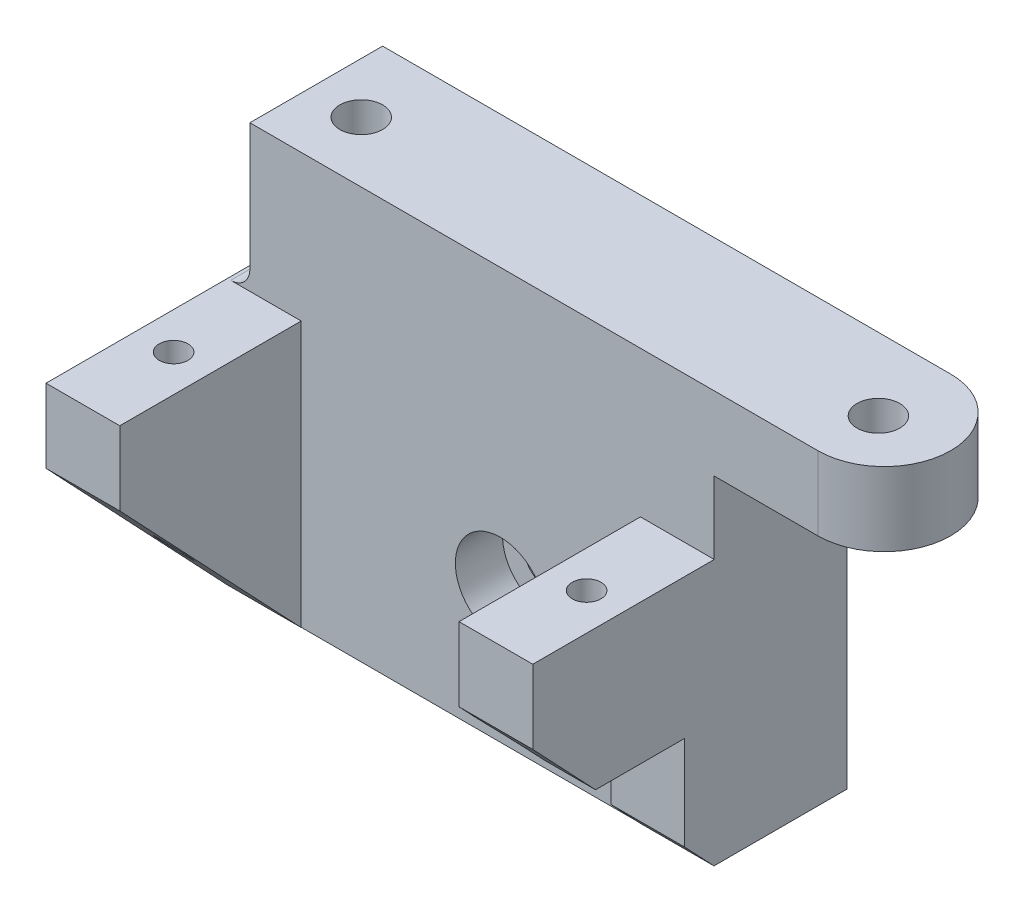
ISO-10303-21;
HEADER;
FILE_DESCRIPTION(('STEP AP214'),'2;1');
FILE_NAME('part.step','',(''),(''),'','','');
FILE_SCHEMA(('AUTOMOTIVE_DESIGN { 1 0 10303 214 1 1 1 1 }'));
ENDSEC;
DATA;
#1=APPLICATION_CONTEXT('core data for automotive mechanical design processes');
#2=APPLICATION_PROTOCOL_DEFINITION('international standard','automotive_design',2000,#1);
#3=PRODUCT_CONTEXT('',#1,'mechanical');
#4=PRODUCT('Part','Part','',(#3));
#5=PRODUCT_RELATED_PRODUCT_CATEGORY('part','',(#4));
#6=PRODUCT_DEFINITION_FORMATION('','',#4);
#7=PRODUCT_DEFINITION_CONTEXT('part definition',#1,'design');
#8=PRODUCT_DEFINITION('design','',#6,#7);
#9=PRODUCT_DEFINITION_SHAPE('','',#8);
#10=(LENGTH_UNIT() NAMED_UNIT(*) SI_UNIT(.MILLI.,.METRE.));
#11=(NAMED_UNIT(*) PLANE_ANGLE_UNIT() SI_UNIT($,.RADIAN.));
#12=(NAMED_UNIT(*) SI_UNIT($,.STERADIAN.) SOLID_ANGLE_UNIT());
#13=UNCERTAINTY_MEASURE_WITH_UNIT(LENGTH_MEASURE(1.E-05),#10,'distance_accuracy_value','');
#14=(GEOMETRIC_REPRESENTATION_CONTEXT(3) GLOBAL_UNCERTAINTY_ASSIGNED_CONTEXT((#13)) GLOBAL_UNIT_ASSIGNED_CONTEXT((#10,
#11,#12)) REPRESENTATION_CONTEXT('',''));
#15=CARTESIAN_POINT('',(0.,0.,0.));
#16=DIRECTION('',(0.,0.,1.));
#17=DIRECTION('',(1.,0.,0.));
#18=AXIS2_PLACEMENT_3D('',#15,#16,#17);
#19=CARTESIAN_POINT('',(16.5,0.,9.));
#20=DIRECTION('',(-1.,0.,0.));
#21=DIRECTION('',(0.,0.,1.));
#22=AXIS2_PLACEMENT_3D('',#19,#20,#21);
#23=PLANE('',#22);
#24=DIRECTION('',(0.,0.,-1.));
#25=VECTOR('',#24,1.);
#26=CARTESIAN_POINT('',(16.5,13.8916881917778,9.));
#27=LINE('',#26,#25);
#28=CARTESIAN_POINT('',(16.5,13.8916881917778,9.));
#29=VERTEX_POINT('',#28);
#30=CARTESIAN_POINT('',(16.5,13.8916881917778,0.));
#31=VERTEX_POINT('',#30);
#32=EDGE_CURVE('E483',#29,#31,#27,.T.);
#33=ORIENTED_EDGE('',*,*,#32,.F.);
#34=DIRECTION('',(0.,-1.,0.));
#35=VECTOR('',#34,1.);
#36=CARTESIAN_POINT('',(16.5,18.8916881917778,9.));
#37=LINE('',#36,#35);
#38=CARTESIAN_POINT('',(16.5,8.99168819177776,9.));
#39=VERTEX_POINT('',#38);
#40=EDGE_CURVE('E401',#29,#39,#37,.T.);
#41=ORIENTED_EDGE('',*,*,#40,.T.);
#42=DIRECTION('',(0.,0.,-1.));
#43=VECTOR('',#42,1.);
#44=CARTESIAN_POINT('',(16.5,8.99168819177776,9.));
#45=LINE('',#44,#43);
#46=CARTESIAN_POINT('',(16.5,8.99168819177776,21.3));
#47=VERTEX_POINT('',#46);
#48=EDGE_CURVE('E209',#47,#39,#45,.T.);
#49=ORIENTED_EDGE('',*,*,#48,.F.);
#50=DIRECTION('',(0.,1.,0.));
#51=VECTOR('',#50,1.);
#52=CARTESIAN_POINT('',(16.5,3.99168819177776,21.3));
#53=LINE('',#52,#51);
#54=CARTESIAN_POINT('',(16.5,3.99168819177776,21.3));
#55=VERTEX_POINT('',#54);
#56=EDGE_CURVE('E371',#55,#47,#53,.T.);
#57=ORIENTED_EDGE('',*,*,#56,.F.);
#58=DIRECTION('',(0.,-0.726393020388627,-0.687279550060009));
#59=VECTOR('',#58,1.);
#60=CARTESIAN_POINT('',(16.5,-4.25510472842094,13.4972651601197));
#61=LINE('',#60,#59);
#62=CARTESIAN_POINT('',(16.5,-0.508311808222242,17.0423076923077));
#63=VERTEX_POINT('',#62);
#64=EDGE_CURVE('E238',#55,#63,#61,.T.);
#65=ORIENTED_EDGE('',*,*,#64,.T.);
#66=DIRECTION('',(0.,0.,-1.));
#67=VECTOR('',#66,1.);
#68=CARTESIAN_POINT('',(16.5,-0.508311808222242,19.));
#69=LINE('',#68,#67);
#70=CARTESIAN_POINT('',(16.5,-0.508311808222242,11.));
#71=VERTEX_POINT('',#70);
#72=EDGE_CURVE('E453',#63,#71,#69,.T.);
#73=ORIENTED_EDGE('',*,*,#72,.T.);
#74=DIRECTION('',(0.,1.,0.));
#75=VECTOR('',#74,1.);
#76=CARTESIAN_POINT('',(16.5,0.,11.));
#77=LINE('',#76,#75);
#78=CARTESIAN_POINT('',(16.5,-6.89449067001086,11.));
#79=VERTEX_POINT('',#78);
#80=EDGE_CURVE('E454',#79,#71,#77,.T.);
#81=ORIENTED_EDGE('',*,*,#80,.F.);
#82=CARTESIAN_POINT('',(16.5,-8.99168819177775,9.01572849863594));
#83=VERTEX_POINT('',#82);
#84=EDGE_CURVE('E237',#79,#83,#61,.T.);
#85=ORIENTED_EDGE('',*,*,#84,.T.);
#86=DIRECTION('',(0.,0.,-1.));
#87=VECTOR('',#86,1.);
#88=CARTESIAN_POINT('',(16.5,-8.99168819177775,9.));
#89=LINE('',#88,#87);
#90=CARTESIAN_POINT('',(16.5,-8.99168819177775,0.));
#91=VERTEX_POINT('',#90);
#92=EDGE_CURVE('E228',#83,#91,#89,.T.);
#93=ORIENTED_EDGE('',*,*,#92,.T.);
#94=DIRECTION('',(0.,1.,0.));
#95=VECTOR('',#94,1.);
#96=CARTESIAN_POINT('',(16.5,0.,0.));
#97=LINE('',#96,#95);
#98=EDGE_CURVE('E218',#91,#31,#97,.T.);
#99=ORIENTED_EDGE('',*,*,#98,.T.);
#100=EDGE_LOOP('',(#33,#41,#49,#57,#65,#73,#81,#85,#93,#99));
#101=FACE_BOUND('',#100,.T.);
#102=ADVANCED_FACE('F47',(#101),#23,.F.);
#103=CARTESIAN_POINT('',(11.5,3.99168819177776,9.));
#104=DIRECTION('',(-1.,0.,0.));
#105=DIRECTION('',(0.,0.,1.));
#106=AXIS2_PLACEMENT_3D('',#103,#104,#105);
#107=PLANE('',#106);
#108=DIRECTION('',(0.,0.726393020388627,0.687279550060009));
#109=VECTOR('',#108,1.);
#110=CARTESIAN_POINT('',(11.5,-9.00831180822224,9.));
#111=LINE('',#110,#109);
#112=CARTESIAN_POINT('',(11.5,-8.99168819177775,9.01572849863594));
#113=VERTEX_POINT('',#112);
#114=CARTESIAN_POINT('',(11.5,-6.89449067001086,11.));
#115=VERTEX_POINT('',#114);
#116=EDGE_CURVE('E234',#113,#115,#111,.T.);
#117=ORIENTED_EDGE('',*,*,#116,.T.);
#118=DIRECTION('',(0.,1.,0.));
#119=VECTOR('',#118,1.);
#120=CARTESIAN_POINT('',(11.5,0.,11.));
#121=LINE('',#120,#119);
#122=CARTESIAN_POINT('',(11.5,-2.6556543449779,11.));
#123=VERTEX_POINT('',#122);
#124=EDGE_CURVE('E507',#115,#123,#121,.T.);
#125=ORIENTED_EDGE('',*,*,#124,.T.);
#126=DIRECTION('',(0.,0.,-1.));
#127=VECTOR('',#126,1.);
#128=CARTESIAN_POINT('',(11.5,-2.6556543449779,21.3));
#129=LINE('',#128,#127);
#130=CARTESIAN_POINT('',(11.5,-2.6556543449779,9.));
#131=VERTEX_POINT('',#130);
#132=EDGE_CURVE('E266',#123,#131,#129,.T.);
#133=ORIENTED_EDGE('',*,*,#132,.T.);
#134=DIRECTION('',(0.,1.,0.));
#135=VECTOR('',#134,1.);
#136=CARTESIAN_POINT('',(11.5,3.99168819177776,9.));
#137=LINE('',#136,#135);
#138=CARTESIAN_POINT('',(11.5,-8.99168819177775,9.));
#139=VERTEX_POINT('',#138);
#140=EDGE_CURVE('E369',#139,#131,#137,.T.);
#141=ORIENTED_EDGE('',*,*,#140,.F.);
#142=DIRECTION('',(0.,0.,-1.));
#143=VECTOR('',#142,1.);
#144=CARTESIAN_POINT('',(11.5,-8.99168819177775,9.));
#145=LINE('',#144,#143);
#146=EDGE_CURVE('E249',#139,#113,#145,.F.);
#147=ORIENTED_EDGE('',*,*,#146,.T.);
#148=EDGE_LOOP('',(#117,#125,#133,#141,#147));
#149=FACE_BOUND('',#148,.T.);
#150=ADVANCED_FACE('F311',(#149),#107,.T.);
#151=CARTESIAN_POINT('',(0.,-9.00831180822224,9.));
#152=DIRECTION('',(0.,0.687279550060009,-0.726393020388627));
#153=DIRECTION('',(-1.,0.,0.));
#154=AXIS2_PLACEMENT_3D('',#151,#152,#153);
#155=PLANE('',#154);
#156=DIRECTION('',(1.,0.,0.));
#157=VECTOR('',#156,1.);
#158=CARTESIAN_POINT('',(0.,-6.89449067001086,11.));
#159=LINE('',#158,#157);
#160=EDGE_CURVE('E380',#115,#79,#159,.T.);
#161=ORIENTED_EDGE('',*,*,#160,.F.);
#162=ORIENTED_EDGE('',*,*,#116,.F.);
#163=DIRECTION('',(-1.,0.,0.));
#164=VECTOR('',#163,1.);
#165=CARTESIAN_POINT('',(0.,-8.99168819177775,9.01572849863594));
#166=LINE('',#165,#164);
#167=EDGE_CURVE('E231',#83,#113,#166,.T.);
#168=ORIENTED_EDGE('',*,*,#167,.F.);
#169=ORIENTED_EDGE('',*,*,#84,.F.);
#170=EDGE_LOOP('',(#161,#162,#168,#169));
#171=FACE_BOUND('',#170,.T.);
#172=ADVANCED_FACE('F317',(#171),#155,.F.);
#173=CARTESIAN_POINT('',(0.,8.99168819177776,9.));
#174=DIRECTION('',(0.,1.,0.));
#175=DIRECTION('',(-1.,0.,0.));
#176=AXIS2_PLACEMENT_3D('',#173,#174,#175);
#177=PLANE('',#176);
#178=DIRECTION('',(1.,0.,0.));
#179=VECTOR('',#178,1.);
#180=CARTESIAN_POINT('',(-16.5,8.99168819177775,9.));
#181=LINE('',#180,#179);
#182=CARTESIAN_POINT('',(-16.28,8.99168819177775,9.));
#183=VERTEX_POINT('',#182);
#184=CARTESIAN_POINT('',(-11.5,8.99168819177775,9.));
#185=VERTEX_POINT('',#184);
#186=EDGE_CURVE('E378',#183,#185,#181,.T.);
#187=ORIENTED_EDGE('',*,*,#186,.F.);
#188=DIRECTION('',(0.,0.,-1.));
#189=VECTOR('',#188,1.);
#190=CARTESIAN_POINT('',(-16.28,8.99168819177775,9.));
#191=LINE('',#190,#189);
#192=CARTESIAN_POINT('',(-16.28,8.99168819177775,0.));
#193=VERTEX_POINT('',#192);
#194=EDGE_CURVE('E197',#183,#193,#191,.T.);
#195=ORIENTED_EDGE('',*,*,#194,.T.);
#196=DIRECTION('',(-1.,0.,0.));
#197=VECTOR('',#196,1.);
#198=CARTESIAN_POINT('',(-16.5,8.99168819177775,0.));
#199=LINE('',#198,#197);
#200=CARTESIAN_POINT('',(-16.5,8.99168819177775,0.));
#201=VERTEX_POINT('',#200);
#202=EDGE_CURVE('E189',#193,#201,#199,.T.);
#203=ORIENTED_EDGE('',*,*,#202,.T.);
#204=DIRECTION('',(0.,0.,-1.));
#205=VECTOR('',#204,1.);
#206=CARTESIAN_POINT('',(-16.5,8.99168819177775,9.));
#207=LINE('',#206,#205);
#208=CARTESIAN_POINT('',(-16.5,8.99168819177775,21.3));
#209=VERTEX_POINT('',#208);
#210=EDGE_CURVE('E194',#209,#201,#207,.T.);
#211=ORIENTED_EDGE('',*,*,#210,.F.);
#212=DIRECTION('',(1.,0.,0.));
#213=VECTOR('',#212,1.);
#214=CARTESIAN_POINT('',(-16.5,8.99168819177775,21.3));
#215=LINE('',#214,#213);
#216=CARTESIAN_POINT('',(-11.5,8.99168819177775,21.3));
#217=VERTEX_POINT('',#216);
#218=EDGE_CURVE('E365',#209,#217,#215,.T.);
#219=ORIENTED_EDGE('',*,*,#218,.T.);
#220=DIRECTION('',(0.,0.,-1.));
#221=VECTOR('',#220,1.);
#222=CARTESIAN_POINT('',(-11.5,8.99168819177775,9.));
#223=LINE('',#222,#221);
#224=EDGE_CURVE('E358',#217,#185,#223,.T.);
#225=ORIENTED_EDGE('',*,*,#224,.T.);
#226=EDGE_LOOP('',(#187,#195,#203,#211,#219,#225));
#227=FACE_BOUND('',#226,.T.);
#228=CARTESIAN_POINT('',(-14.,8.99168819177775,15.15));
#229=DIRECTION('',(0.,1.,0.));
#230=DIRECTION('',(-1.,0.,0.));
#231=AXIS2_PLACEMENT_3D('',#228,#229,#230);
#232=CIRCLE('',#231,0.975);
#233=CARTESIAN_POINT('',(-14.975,8.99168819177775,15.15));
#234=VERTEX_POINT('',#233);
#235=EDGE_CURVE('E277',#234,#234,#232,.T.);
#236=ORIENTED_EDGE('',*,*,#235,.F.);
#237=EDGE_LOOP('',(#236));
#238=FACE_BOUND('',#237,.T.);
#239=ADVANCED_FACE('F191',(#227,#238),#177,.T.);
#240=CARTESIAN_POINT('',(11.5,2.6556543449779,9.));
#241=VERTEX_POINT('',#240);
#242=CARTESIAN_POINT('',(11.5,8.99168819177776,9.));
#243=VERTEX_POINT('',#242);
#244=EDGE_CURVE('E427',#241,#243,#137,.T.);
#245=ORIENTED_EDGE('',*,*,#244,.F.);
#246=DIRECTION('',(0.,0.,-1.));
#247=VECTOR('',#246,1.);
#248=CARTESIAN_POINT('',(11.5,2.6556543449779,21.3));
#249=LINE('',#248,#247);
#250=CARTESIAN_POINT('',(11.5,2.6556543449779,20.0359064372586));
#251=VERTEX_POINT('',#250);
#252=EDGE_CURVE('E413',#241,#251,#249,.F.);
#253=ORIENTED_EDGE('',*,*,#252,.T.);
#254=CARTESIAN_POINT('',(11.5,3.99168819177776,21.3));
#255=VERTEX_POINT('',#254);
#256=EDGE_CURVE('E233',#251,#255,#111,.T.);
#257=ORIENTED_EDGE('',*,*,#256,.T.);
#258=DIRECTION('',(0.,1.,0.));
#259=VECTOR('',#258,1.);
#260=CARTESIAN_POINT('',(11.5,3.99168819177776,21.3));
#261=LINE('',#260,#259);
#262=CARTESIAN_POINT('',(11.5,8.99168819177776,21.3));
#263=VERTEX_POINT('',#262);
#264=EDGE_CURVE('E434',#255,#263,#261,.T.);
#265=ORIENTED_EDGE('',*,*,#264,.T.);
#266=DIRECTION('',(0.,0.,1.));
#267=VECTOR('',#266,1.);
#268=CARTESIAN_POINT('',(11.5,8.99168819177776,9.));
#269=LINE('',#268,#267);
#270=EDGE_CURVE('E423',#243,#263,#269,.T.);
#271=ORIENTED_EDGE('',*,*,#270,.F.);
#272=EDGE_LOOP('',(#245,#253,#257,#265,#271));
#273=FACE_BOUND('',#272,.T.);
#274=ADVANCED_FACE('F320',(#273),#107,.T.);
#275=CARTESIAN_POINT('',(10.,0.,21.3));
#276=DIRECTION('',(0.,0.,-1.));
#277=DIRECTION('',(-1.,0.,0.));
#278=AXIS2_PLACEMENT_3D('',#275,#276,#277);
#279=CYLINDRICAL_SURFACE('',#278,1.575);
#280=CARTESIAN_POINT('',(10.,0.,0.));
#281=DIRECTION('',(0.,0.,-1.));
#282=DIRECTION('',(-1.,0.,0.));
#283=AXIS2_PLACEMENT_3D('',#280,#281,#282);
#284=CIRCLE('',#283,1.575);
#285=CARTESIAN_POINT('',(8.425,0.,0.));
#286=VERTEX_POINT('',#285);
#287=EDGE_CURVE('E262',#286,#286,#284,.T.);
#288=ORIENTED_EDGE('',*,*,#287,.T.);
#289=EDGE_LOOP('',(#288));
#290=FACE_BOUND('',#289,.T.);
#291=CARTESIAN_POINT('',(10.,0.,5.8));
#292=DIRECTION('',(0.,0.,1.));
#293=DIRECTION('',(1.,0.,0.));
#294=AXIS2_PLACEMENT_3D('',#291,#292,#293);
#295=CIRCLE('',#294,1.575);
#296=CARTESIAN_POINT('',(11.575,0.,5.8));
#297=VERTEX_POINT('',#296);
#298=EDGE_CURVE('E263',#297,#297,#295,.F.);
#299=ORIENTED_EDGE('',*,*,#298,.F.);
#300=EDGE_LOOP('',(#299));
#301=FACE_BOUND('',#300,.T.);
#302=ADVANCED_FACE('F569',(#290,#301),#279,.F.);
#303=CARTESIAN_POINT('',(2.,0.,21.3));
#304=DIRECTION('',(0.,0.,-1.));
#305=DIRECTION('',(-1.,0.,0.));
#306=AXIS2_PLACEMENT_3D('',#303,#304,#305);
#307=CYLINDRICAL_SURFACE('',#306,1.575);
#308=CARTESIAN_POINT('',(2.,0.,0.));
#309=DIRECTION('',(0.,0.,-1.));
#310=DIRECTION('',(-1.,0.,0.));
#311=AXIS2_PLACEMENT_3D('',#308,#309,#310);
#312=CIRCLE('',#311,1.575);
#313=CARTESIAN_POINT('',(0.425,0.,0.));
#314=VERTEX_POINT('',#313);
#315=EDGE_CURVE('E420',#314,#314,#312,.T.);
#316=ORIENTED_EDGE('',*,*,#315,.T.);
#317=EDGE_LOOP('',(#316));
#318=FACE_BOUND('',#317,.T.);
#319=CARTESIAN_POINT('',(2.,0.,5.8));
#320=DIRECTION('',(0.,0.,1.));
#321=DIRECTION('',(1.,0.,0.));
#322=AXIS2_PLACEMENT_3D('',#319,#320,#321);
#323=CIRCLE('',#322,1.575);
#324=CARTESIAN_POINT('',(3.575,0.,5.8));
#325=VERTEX_POINT('',#324);
#326=EDGE_CURVE('E255',#325,#325,#323,.F.);
#327=ORIENTED_EDGE('',*,*,#326,.F.);
#328=EDGE_LOOP('',(#327));
#329=FACE_BOUND('',#328,.T.);
#330=ADVANCED_FACE('F328',(#318,#329),#307,.F.);
#331=CARTESIAN_POINT('',(0.,-8.99168819177775,9.));
#332=DIRECTION('',(0.,1.,0.));
#333=DIRECTION('',(0.,0.,1.));
#334=AXIS2_PLACEMENT_3D('',#331,#332,#333);
#335=PLANE('',#334);
#336=DIRECTION('',(1.,0.,0.));
#337=VECTOR('',#336,1.);
#338=CARTESIAN_POINT('',(0.,-8.99168819177775,0.));
#339=LINE('',#338,#337);
#340=CARTESIAN_POINT('',(-16.5,-8.99168819177775,0.));
#341=VERTEX_POINT('',#340);
#342=EDGE_CURVE('E216',#341,#91,#339,.T.);
#343=ORIENTED_EDGE('',*,*,#342,.T.);
#344=ORIENTED_EDGE('',*,*,#92,.F.);
#345=ORIENTED_EDGE('',*,*,#167,.T.);
#346=ORIENTED_EDGE('',*,*,#146,.F.);
#347=DIRECTION('',(1.,0.,0.));
#348=VECTOR('',#347,1.);
#349=CARTESIAN_POINT('',(0.,-8.99168819177775,9.));
#350=LINE('',#349,#348);
#351=CARTESIAN_POINT('',(-11.5,-8.99168819177775,9.));
#352=VERTEX_POINT('',#351);
#353=EDGE_CURVE('E217',#352,#139,#350,.T.);
#354=ORIENTED_EDGE('',*,*,#353,.F.);
#355=DIRECTION('',(0.,0.,1.));
#356=VECTOR('',#355,1.);
#357=CARTESIAN_POINT('',(-11.5,-8.99168819177775,9.));
#358=LINE('',#357,#356);
#359=CARTESIAN_POINT('',(-11.5,-8.99168819177775,9.01572849863594));
#360=VERTEX_POINT('',#359);
#361=EDGE_CURVE('E248',#352,#360,#358,.T.);
#362=ORIENTED_EDGE('',*,*,#361,.T.);
#363=DIRECTION('',(-1.,0.,0.));
#364=VECTOR('',#363,1.);
#365=CARTESIAN_POINT('',(0.,-8.99168819177775,9.01572849863594));
#366=LINE('',#365,#364);
#367=CARTESIAN_POINT('',(-16.5,-8.99168819177775,9.01572849863594));
#368=VERTEX_POINT('',#367);
#369=EDGE_CURVE('E241',#360,#368,#366,.T.);
#370=ORIENTED_EDGE('',*,*,#369,.T.);
#371=DIRECTION('',(0.,0.,-1.));
#372=VECTOR('',#371,1.);
#373=CARTESIAN_POINT('',(-16.5,-8.99168819177775,9.));
#374=LINE('',#373,#372);
#375=EDGE_CURVE('E210',#368,#341,#374,.T.);
#376=ORIENTED_EDGE('',*,*,#375,.T.);
#377=EDGE_LOOP('',(#343,#344,#345,#346,#354,#362,#370,#376));
#378=FACE_BOUND('',#377,.T.);
#379=ADVANCED_FACE('F325',(#378),#335,.F.);
#380=EDGE_CURVE('E269',#243,#39,#181,.T.);
#381=ORIENTED_EDGE('',*,*,#380,.F.);
#382=ORIENTED_EDGE('',*,*,#270,.T.);
#383=DIRECTION('',(1.,0.,0.));
#384=VECTOR('',#383,1.);
#385=CARTESIAN_POINT('',(16.5,8.99168819177776,21.3));
#386=LINE('',#385,#384);
#387=EDGE_CURVE('E428',#263,#47,#386,.T.);
#388=ORIENTED_EDGE('',*,*,#387,.T.);
#389=ORIENTED_EDGE('',*,*,#48,.T.);
#390=EDGE_LOOP('',(#381,#382,#388,#389));
#391=FACE_BOUND('',#390,.T.);
#392=CARTESIAN_POINT('',(14.,8.99168819177776,15.15));
#393=DIRECTION('',(0.,1.,0.));
#394=DIRECTION('',(1.,0.,0.));
#395=AXIS2_PLACEMENT_3D('',#392,#393,#394);
#396=CIRCLE('',#395,0.975);
#397=CARTESIAN_POINT('',(14.975,8.99168819177776,15.15));
#398=VERTEX_POINT('',#397);
#399=EDGE_CURVE('E278',#398,#398,#396,.T.);
#400=ORIENTED_EDGE('',*,*,#399,.F.);
#401=EDGE_LOOP('',(#400));
#402=FACE_BOUND('',#401,.T.);
#403=ADVANCED_FACE('F323',(#391,#402),#177,.T.);
#404=CARTESIAN_POINT('',(-16.5,0.,9.));
#405=DIRECTION('',(-1.,0.,0.));
#406=DIRECTION('',(0.,0.,1.));
#407=AXIS2_PLACEMENT_3D('',#404,#405,#406);
#408=PLANE('',#407);
#409=ORIENTED_EDGE('',*,*,#210,.T.);
#410=DIRECTION('',(0.,1.,0.));
#411=VECTOR('',#410,1.);
#412=CARTESIAN_POINT('',(-16.5,0.,0.));
#413=LINE('',#412,#411);
#414=EDGE_CURVE('E205',#341,#201,#413,.T.);
#415=ORIENTED_EDGE('',*,*,#414,.F.);
#416=ORIENTED_EDGE('',*,*,#375,.F.);
#417=DIRECTION('',(0.,0.726393020388627,0.687279550060009));
#418=VECTOR('',#417,1.);
#419=CARTESIAN_POINT('',(-16.5,-9.00831180822224,9.));
#420=LINE('',#419,#418);
#421=CARTESIAN_POINT('',(-16.5,3.99168819177775,21.3));
#422=VERTEX_POINT('',#421);
#423=EDGE_CURVE('E244',#368,#422,#420,.T.);
#424=ORIENTED_EDGE('',*,*,#423,.T.);
#425=DIRECTION('',(0.,1.,0.));
#426=VECTOR('',#425,1.);
#427=CARTESIAN_POINT('',(-16.5,3.99168819177775,21.3));
#428=LINE('',#427,#426);
#429=EDGE_CURVE('E207',#422,#209,#428,.T.);
#430=ORIENTED_EDGE('',*,*,#429,.T.);
#431=EDGE_LOOP('',(#409,#415,#416,#424,#430));
#432=FACE_BOUND('',#431,.T.);
#433=ADVANCED_FACE('F204',(#432),#408,.T.);
#434=CARTESIAN_POINT('',(0.,0.,9.));
#435=DIRECTION('',(0.,0.,1.));
#436=DIRECTION('',(1.,0.,0.));
#437=AXIS2_PLACEMENT_3D('',#434,#435,#436);
#438=PLANE('',#437);
#439=DIRECTION('',(0.,-1.,0.));
#440=VECTOR('',#439,1.);
#441=CARTESIAN_POINT('',(-14.98,18.8916881917778,9.));
#442=LINE('',#441,#440);
#443=CARTESIAN_POINT('',(-14.98,18.8916881917778,9.));
#444=VERTEX_POINT('',#443);
#445=CARTESIAN_POINT('',(-14.98,10.2916881917778,9.));
#446=VERTEX_POINT('',#445);
#447=EDGE_CURVE('E386',#444,#446,#442,.T.);
#448=ORIENTED_EDGE('',*,*,#447,.T.);
#449=CARTESIAN_POINT('',(-16.28,10.2916881917778,9.));
#450=DIRECTION('',(0.,0.,1.));
#451=DIRECTION('',(1.,0.,0.));
#452=AXIS2_PLACEMENT_3D('',#449,#450,#451);
#453=CIRCLE('',#452,1.3);
#454=EDGE_CURVE('E13',#446,#183,#453,.F.);
#455=ORIENTED_EDGE('',*,*,#454,.T.);
#456=ORIENTED_EDGE('',*,*,#186,.T.);
#457=DIRECTION('',(0.,1.,0.));
#458=VECTOR('',#457,1.);
#459=CARTESIAN_POINT('',(-11.5,3.99168819177775,9.));
#460=LINE('',#459,#458);
#461=EDGE_CURVE('E360',#352,#185,#460,.T.);
#462=ORIENTED_EDGE('',*,*,#461,.F.);
#463=ORIENTED_EDGE('',*,*,#353,.T.);
#464=ORIENTED_EDGE('',*,*,#140,.T.);
#465=CARTESIAN_POINT('',(10.,0.,9.));
#466=DIRECTION('',(0.,0.,1.));
#467=DIRECTION('',(1.,0.,0.));
#468=AXIS2_PLACEMENT_3D('',#465,#466,#467);
#469=CIRCLE('',#468,3.05);
#470=EDGE_CURVE('E410',#131,#241,#469,.F.);
#471=ORIENTED_EDGE('',*,*,#470,.T.);
#472=ORIENTED_EDGE('',*,*,#244,.T.);
#473=ORIENTED_EDGE('',*,*,#380,.T.);
#474=ORIENTED_EDGE('',*,*,#40,.F.);
#475=DIRECTION('',(-1.,0.,0.));
#476=VECTOR('',#475,1.);
#477=CARTESIAN_POINT('',(23.53,13.8916881917778,9.));
#478=LINE('',#477,#476);
#479=CARTESIAN_POINT('',(23.53,13.8916881917778,9.));
#480=VERTEX_POINT('',#479);
#481=EDGE_CURVE('E479',#480,#29,#478,.T.);
#482=ORIENTED_EDGE('',*,*,#481,.F.);
#483=DIRECTION('',(0.,1.,0.));
#484=VECTOR('',#483,1.);
#485=CARTESIAN_POINT('',(23.53,13.8916881917778,9.));
#486=LINE('',#485,#484);
#487=CARTESIAN_POINT('',(23.53,18.8916881917778,9.));
#488=VERTEX_POINT('',#487);
#489=EDGE_CURVE('E477',#480,#488,#486,.T.);
#490=ORIENTED_EDGE('',*,*,#489,.T.);
#491=DIRECTION('',(1.,0.,0.));
#492=VECTOR('',#491,1.);
#493=CARTESIAN_POINT('',(-16.5,18.8916881917778,9.));
#494=LINE('',#493,#492);
#495=EDGE_CURVE('E399',#444,#488,#494,.T.);
#496=ORIENTED_EDGE('',*,*,#495,.F.);
#497=EDGE_LOOP('',(#448,#455,#456,#462,#463,#464,#471,#472,#473,#474,#482,#490,#496));
#498=FACE_BOUND('',#497,.T.);
#499=CARTESIAN_POINT('',(2.,0.,9.));
#500=DIRECTION('',(0.,0.,1.));
#501=DIRECTION('',(1.,0.,0.));
#502=AXIS2_PLACEMENT_3D('',#499,#500,#501);
#503=CIRCLE('',#502,3.05);
#504=CARTESIAN_POINT('',(5.05,0.,9.));
#505=VERTEX_POINT('',#504);
#506=EDGE_CURVE('E258',#505,#505,#503,.F.);
#507=ORIENTED_EDGE('',*,*,#506,.T.);
#508=EDGE_LOOP('',(#507));
#509=FACE_BOUND('',#508,.T.);
#510=ADVANCED_FACE('F383',(#498,#509),#438,.T.);
#511=CARTESIAN_POINT('',(0.,0.,0.));
#512=DIRECTION('',(0.,0.,1.));
#513=DIRECTION('',(1.,0.,0.));
#514=AXIS2_PLACEMENT_3D('',#511,#512,#513);
#515=PLANE('',#514);
#516=ORIENTED_EDGE('',*,*,#202,.F.);
#517=CARTESIAN_POINT('',(-16.28,10.2916881917778,0.));
#518=DIRECTION('',(0.,0.,1.));
#519=DIRECTION('',(1.,0.,0.));
#520=AXIS2_PLACEMENT_3D('',#517,#518,#519);
#521=CIRCLE('',#520,1.3);
#522=CARTESIAN_POINT('',(-14.98,10.2916881917778,0.));
#523=VERTEX_POINT('',#522);
#524=EDGE_CURVE('E55',#193,#523,#521,.T.);
#525=ORIENTED_EDGE('',*,*,#524,.T.);
#526=DIRECTION('',(0.,-1.,0.));
#527=VECTOR('',#526,1.);
#528=CARTESIAN_POINT('',(-14.98,18.8916881917778,0.));
#529=LINE('',#528,#527);
#530=CARTESIAN_POINT('',(-14.98,18.8916881917778,0.));
#531=VERTEX_POINT('',#530);
#532=EDGE_CURVE('E200',#531,#523,#529,.T.);
#533=ORIENTED_EDGE('',*,*,#532,.F.);
#534=DIRECTION('',(-1.,0.,0.));
#535=VECTOR('',#534,1.);
#536=CARTESIAN_POINT('',(-16.5,18.8916881917778,0.));
#537=LINE('',#536,#535);
#538=CARTESIAN_POINT('',(23.53,18.8916881917778,0.));
#539=VERTEX_POINT('',#538);
#540=EDGE_CURVE('E379',#539,#531,#537,.T.);
#541=ORIENTED_EDGE('',*,*,#540,.F.);
#542=DIRECTION('',(0.,1.,0.));
#543=VECTOR('',#542,1.);
#544=CARTESIAN_POINT('',(23.53,13.8916881917778,0.));
#545=LINE('',#544,#543);
#546=CARTESIAN_POINT('',(23.53,13.8916881917778,0.));
#547=VERTEX_POINT('',#546);
#548=EDGE_CURVE('E484',#547,#539,#545,.T.);
#549=ORIENTED_EDGE('',*,*,#548,.F.);
#550=DIRECTION('',(1.,0.,0.));
#551=VECTOR('',#550,1.);
#552=CARTESIAN_POINT('',(23.53,13.8916881917778,0.));
#553=LINE('',#552,#551);
#554=EDGE_CURVE('E492',#31,#547,#553,.T.);
#555=ORIENTED_EDGE('',*,*,#554,.F.);
#556=ORIENTED_EDGE('',*,*,#98,.F.);
#557=ORIENTED_EDGE('',*,*,#342,.F.);
#558=ORIENTED_EDGE('',*,*,#414,.T.);
#559=EDGE_LOOP('',(#516,#525,#533,#541,#549,#555,#556,#557,#558));
#560=FACE_BOUND('',#559,.T.);
#561=ORIENTED_EDGE('',*,*,#287,.F.);
#562=EDGE_LOOP('',(#561));
#563=FACE_BOUND('',#562,.T.);
#564=ORIENTED_EDGE('',*,*,#315,.F.);
#565=EDGE_LOOP('',(#564));
#566=FACE_BOUND('',#565,.T.);
#567=ADVANCED_FACE('F213',(#560,#563,#566),#515,.F.);
#568=CARTESIAN_POINT('',(-11.5,3.99168819177775,9.));
#569=DIRECTION('',(1.,0.,0.));
#570=DIRECTION('',(0.,1.,0.));
#571=AXIS2_PLACEMENT_3D('',#568,#569,#570);
#572=PLANE('',#571);
#573=ORIENTED_EDGE('',*,*,#224,.F.);
#574=DIRECTION('',(0.,1.,0.));
#575=VECTOR('',#574,1.);
#576=CARTESIAN_POINT('',(-11.5,3.99168819177775,21.3));
#577=LINE('',#576,#575);
#578=CARTESIAN_POINT('',(-11.5,3.99168819177775,21.3));
#579=VERTEX_POINT('',#578);
#580=EDGE_CURVE('E354',#579,#217,#577,.T.);
#581=ORIENTED_EDGE('',*,*,#580,.F.);
#582=DIRECTION('',(0.,-0.726393020388627,-0.687279550060009));
#583=VECTOR('',#582,1.);
#584=CARTESIAN_POINT('',(-11.5,-9.00831180822224,9.));
#585=LINE('',#584,#583);
#586=EDGE_CURVE('E246',#579,#360,#585,.T.);
#587=ORIENTED_EDGE('',*,*,#586,.T.);
#588=ORIENTED_EDGE('',*,*,#361,.F.);
#589=ORIENTED_EDGE('',*,*,#461,.T.);
#590=EDGE_LOOP('',(#573,#581,#587,#588,#589));
#591=FACE_BOUND('',#590,.T.);
#592=ADVANCED_FACE('F355',(#591),#572,.T.);
#593=CARTESIAN_POINT('',(-16.5,3.99168819177775,21.3));
#594=DIRECTION('',(0.,0.,1.));
#595=DIRECTION('',(1.,0.,0.));
#596=AXIS2_PLACEMENT_3D('',#593,#594,#595);
#597=PLANE('',#596);
#598=ORIENTED_EDGE('',*,*,#218,.F.);
#599=ORIENTED_EDGE('',*,*,#429,.F.);
#600=DIRECTION('',(1.,0.,0.));
#601=VECTOR('',#600,1.);
#602=CARTESIAN_POINT('',(-16.5,3.99168819177775,21.3));
#603=LINE('',#602,#601);
#604=EDGE_CURVE('E350',#422,#579,#603,.T.);
#605=ORIENTED_EDGE('',*,*,#604,.T.);
#606=ORIENTED_EDGE('',*,*,#580,.T.);
#607=EDGE_LOOP('',(#598,#599,#605,#606));
#608=FACE_BOUND('',#607,.T.);
#609=ADVANCED_FACE('F362',(#608),#597,.T.);
#610=CARTESIAN_POINT('',(16.5,3.99168819177776,21.3));
#611=DIRECTION('',(0.,0.,1.));
#612=DIRECTION('',(1.,0.,0.));
#613=AXIS2_PLACEMENT_3D('',#610,#611,#612);
#614=PLANE('',#613);
#615=ORIENTED_EDGE('',*,*,#387,.F.);
#616=ORIENTED_EDGE('',*,*,#264,.F.);
#617=DIRECTION('',(1.,0.,0.));
#618=VECTOR('',#617,1.);
#619=CARTESIAN_POINT('',(16.5,3.99168819177776,21.3));
#620=LINE('',#619,#618);
#621=EDGE_CURVE('E424',#255,#55,#620,.T.);
#622=ORIENTED_EDGE('',*,*,#621,.T.);
#623=ORIENTED_EDGE('',*,*,#56,.T.);
#624=EDGE_LOOP('',(#615,#616,#622,#623));
#625=FACE_BOUND('',#624,.T.);
#626=ADVANCED_FACE('F333',(#625),#614,.T.);
#627=CARTESIAN_POINT('',(10.,0.,17.5232488647026));
#628=DIRECTION('',(0.,0.687279550060009,-0.726393020388627));
#629=DIRECTION('',(0.,-0.726393020388627,-0.687279550060009));
#630=AXIS2_PLACEMENT_3D('',#627,#628,#629);
#631=ELLIPSE('',#630,4.19882889068541,3.05);
#632=CARTESIAN_POINT('',(13.0073441947376,-0.508311808222242,17.0423076923077));
#633=VERTEX_POINT('',#632);
#634=EDGE_CURVE('E252',#633,#251,#631,.F.);
#635=ORIENTED_EDGE('',*,*,#634,.F.);
#636=DIRECTION('',(1.,0.,0.));
#637=VECTOR('',#636,1.);
#638=CARTESIAN_POINT('',(0.,-0.508311808222242,17.0423076923077));
#639=LINE('',#638,#637);
#640=EDGE_CURVE('E450',#633,#63,#639,.T.);
#641=ORIENTED_EDGE('',*,*,#640,.T.);
#642=ORIENTED_EDGE('',*,*,#64,.F.);
#643=ORIENTED_EDGE('',*,*,#621,.F.);
#644=ORIENTED_EDGE('',*,*,#256,.F.);
#645=EDGE_LOOP('',(#635,#641,#642,#643,#644));
#646=FACE_BOUND('',#645,.T.);
#647=ADVANCED_FACE('F330',(#646),#155,.F.);
#648=CARTESIAN_POINT('',(0.,-9.00831180822224,9.));
#649=DIRECTION('',(0.,0.687279550060009,-0.726393020388627));
#650=DIRECTION('',(-1.,0.,0.));
#651=AXIS2_PLACEMENT_3D('',#648,#649,#650);
#652=PLANE('',#651);
#653=CARTESIAN_POINT('',(-14.,-2.50831180822224,15.15));
#654=DIRECTION('',(0.,0.687279550060009,-0.726393020388627));
#655=DIRECTION('',(0.,0.726393020388627,0.687279550060009));
#656=AXIS2_PLACEMENT_3D('',#653,#654,#655);
#657=ELLIPSE('',#656,1.41863671036752,0.975);
#658=CARTESIAN_POINT('',(-14.,-1.4778240033442,16.125));
#659=VERTEX_POINT('',#658);
#660=EDGE_CURVE('E344',#659,#659,#657,.F.);
#661=ORIENTED_EDGE('',*,*,#660,.F.);
#662=EDGE_LOOP('',(#661));
#663=FACE_BOUND('',#662,.T.);
#664=ORIENTED_EDGE('',*,*,#586,.F.);
#665=ORIENTED_EDGE('',*,*,#604,.F.);
#666=ORIENTED_EDGE('',*,*,#423,.F.);
#667=ORIENTED_EDGE('',*,*,#369,.F.);
#668=EDGE_LOOP('',(#664,#665,#666,#667));
#669=FACE_BOUND('',#668,.T.);
#670=ADVANCED_FACE('F332',(#663,#669),#652,.F.);
#671=CARTESIAN_POINT('',(2.,0.,5.8));
#672=DIRECTION('',(0.,0.,1.));
#673=DIRECTION('',(1.,0.,0.));
#674=AXIS2_PLACEMENT_3D('',#671,#672,#673);
#675=PLANE('',#674);
#676=CARTESIAN_POINT('',(2.,0.,5.8));
#677=DIRECTION('',(0.,0.,1.));
#678=DIRECTION('',(1.,0.,0.));
#679=AXIS2_PLACEMENT_3D('',#676,#677,#678);
#680=CIRCLE('',#679,3.05);
#681=CARTESIAN_POINT('',(5.05,0.,5.8));
#682=VERTEX_POINT('',#681);
#683=EDGE_CURVE('E259',#682,#682,#680,.T.);
#684=ORIENTED_EDGE('',*,*,#683,.T.);
#685=EDGE_LOOP('',(#684));
#686=FACE_BOUND('',#685,.T.);
#687=ORIENTED_EDGE('',*,*,#326,.T.);
#688=EDGE_LOOP('',(#687));
#689=FACE_BOUND('',#688,.T.);
#690=ADVANCED_FACE('F305',(#686,#689),#675,.T.);
#691=CARTESIAN_POINT('',(2.,0.,21.3));
#692=DIRECTION('',(0.,0.,-1.));
#693=DIRECTION('',(-1.,0.,0.));
#694=AXIS2_PLACEMENT_3D('',#691,#692,#693);
#695=CYLINDRICAL_SURFACE('',#694,3.05);
#696=ORIENTED_EDGE('',*,*,#506,.F.);
#697=EDGE_LOOP('',(#696));
#698=FACE_BOUND('',#697,.T.);
#699=ORIENTED_EDGE('',*,*,#683,.F.);
#700=EDGE_LOOP('',(#699));
#701=FACE_BOUND('',#700,.T.);
#702=ADVANCED_FACE('F298',(#698,#701),#695,.F.);
#703=CARTESIAN_POINT('',(10.,0.,5.8));
#704=DIRECTION('',(0.,0.,1.));
#705=DIRECTION('',(1.,0.,0.));
#706=AXIS2_PLACEMENT_3D('',#703,#704,#705);
#707=PLANE('',#706);
#708=CARTESIAN_POINT('',(10.,0.,5.8));
#709=DIRECTION('',(0.,0.,1.));
#710=DIRECTION('',(1.,0.,0.));
#711=AXIS2_PLACEMENT_3D('',#708,#709,#710);
#712=CIRCLE('',#711,3.05);
#713=CARTESIAN_POINT('',(13.05,0.,5.8));
#714=VERTEX_POINT('',#713);
#715=EDGE_CURVE('E267',#714,#714,#712,.T.);
#716=ORIENTED_EDGE('',*,*,#715,.T.);
#717=EDGE_LOOP('',(#716));
#718=FACE_BOUND('',#717,.T.);
#719=ORIENTED_EDGE('',*,*,#298,.T.);
#720=EDGE_LOOP('',(#719));
#721=FACE_BOUND('',#720,.T.);
#722=ADVANCED_FACE('F296',(#718,#721),#707,.T.);
#723=CARTESIAN_POINT('',(10.,0.,21.3));
#724=DIRECTION('',(0.,0.,-1.));
#725=DIRECTION('',(-1.,0.,0.));
#726=AXIS2_PLACEMENT_3D('',#723,#724,#725);
#727=CYLINDRICAL_SURFACE('',#726,3.05);
#728=DIRECTION('',(0.,0.,-1.));
#729=VECTOR('',#728,1.);
#730=CARTESIAN_POINT('',(13.0073441947376,-0.508311808222242,21.3));
#731=LINE('',#730,#729);
#732=CARTESIAN_POINT('',(13.0073441947376,-0.508311808222242,11.));
#733=VERTEX_POINT('',#732);
#734=EDGE_CURVE('E461',#633,#733,#731,.T.);
#735=ORIENTED_EDGE('',*,*,#734,.F.);
#736=ORIENTED_EDGE('',*,*,#634,.T.);
#737=ORIENTED_EDGE('',*,*,#252,.F.);
#738=ORIENTED_EDGE('',*,*,#470,.F.);
#739=ORIENTED_EDGE('',*,*,#132,.F.);
#740=CARTESIAN_POINT('',(10.,0.,11.));
#741=DIRECTION('',(0.,0.,1.));
#742=DIRECTION('',(1.,0.,0.));
#743=AXIS2_PLACEMENT_3D('',#740,#741,#742);
#744=CIRCLE('',#743,3.05);
#745=EDGE_CURVE('E388',#123,#733,#744,.T.);
#746=ORIENTED_EDGE('',*,*,#745,.T.);
#747=EDGE_LOOP('',(#735,#736,#737,#738,#739,#746));
#748=FACE_BOUND('',#747,.T.);
#749=CARTESIAN_POINT('',(13.025,-0.389711431702955,15.15));
#750=CARTESIAN_POINT('',(13.0250001453622,-0.389710531239865,15.157411772088));
#751=CARTESIAN_POINT('',(13.0250855790775,-0.389048916411447,15.1648319649063));
#752=CARTESIAN_POINT('',(13.0254172600812,-0.386460849574454,15.1794491938379));
#753=CARTESIAN_POINT('',(13.0256638000037,-0.384532095894771,15.1866457988591));
#754=CARTESIAN_POINT('',(13.0262882649623,-0.379585830311117,15.2005851830621));
#755=CARTESIAN_POINT('',(13.0266652539056,-0.376576069943163,15.2073307976863));
#756=CARTESIAN_POINT('',(13.0275179700306,-0.369658136675126,15.2203291961921));
#757=CARTESIAN_POINT('',(13.0279937112999,-0.365749835583734,15.2265819095824));
#758=CARTESIAN_POINT('',(13.0293474328232,-0.354406919181851,15.2425110909014));
#759=CARTESIAN_POINT('',(13.0302841822032,-0.346343603082375,15.251734793809));
#760=CARTESIAN_POINT('',(13.0322287513291,-0.32888742134588,15.2688187544326));
#761=CARTESIAN_POINT('',(13.0332367858407,-0.319490443929542,15.2766746216534));
#762=CARTESIAN_POINT('',(13.0358918969715,-0.293465918872618,15.2958310535401));
#763=CARTESIAN_POINT('',(13.0375326242315,-0.276077850242564,15.3060936713084));
#764=CARTESIAN_POINT('',(13.0405987120761,-0.239983654168879,15.3239378908324));
#765=CARTESIAN_POINT('',(13.0420236199694,-0.221274873680514,15.3315139007267));
#766=CARTESIAN_POINT('',(13.0453709639445,-0.170862902818628,15.34856661859));
#767=CARTESIAN_POINT('',(13.0470284653947,-0.138504015457277,15.3561583420488));
#768=CARTESIAN_POINT('',(13.0493049565941,-0.0729642977561719,15.366397621448));
#769=CARTESIAN_POINT('',(13.0499213694097,-0.0397816335620345,15.3690329108999));
#770=CARTESIAN_POINT('',(13.0500675975427,0.0280894893779001,15.3696675554815));
#771=CARTESIAN_POINT('',(13.0495484762741,0.0627800444907397,15.3674581137994));
#772=CARTESIAN_POINT('',(13.0473629167991,0.131311524426781,15.3576933002984));
#773=CARTESIAN_POINT('',(13.0457007392506,0.165155122333346,15.3501577781617));
#774=CARTESIAN_POINT('',(13.0425534297031,0.21358689447606,15.3342452189358));
#775=CARTESIAN_POINT('',(13.0414270336073,0.229022730216153,15.328350906242));
#776=CARTESIAN_POINT('',(13.0390091804475,0.259132415444743,15.3148325322611));
#777=CARTESIAN_POINT('',(13.037717691952,0.273806119083655,15.307208141376));
#778=CARTESIAN_POINT('',(13.0352581955601,0.299751520955611,15.2912544816236));
#779=CARTESIAN_POINT('',(13.0341016902281,0.311199574563261,15.2832133544637));
#780=CARTESIAN_POINT('',(13.0318173333464,0.332715331767892,15.2654446013905));
#781=CARTESIAN_POINT('',(13.0306894158484,0.342786504144298,15.2557213588279));
#782=CARTESIAN_POINT('',(13.0289962165163,0.357371317772634,15.2384352804344));
#783=CARTESIAN_POINT('',(13.0283791351199,0.362548712201219,15.2314400032039));
#784=CARTESIAN_POINT('',(13.0272587473374,0.371787611853136,15.2167354210243));
#785=CARTESIAN_POINT('',(13.0267552892252,0.375850606764288,15.2090270878886));
#786=CARTESIAN_POINT('',(13.0259785290247,0.382050137471597,15.194200249764));
#787=CARTESIAN_POINT('',(13.0256820495932,0.384384061536663,15.1871663116143));
#788=CARTESIAN_POINT('',(13.0252402643736,0.387845924232369,15.1728017971066));
#789=CARTESIAN_POINT('',(13.0250948501422,0.388974727983133,15.1654714374696));
#790=CARTESIAN_POINT('',(13.0249722191668,0.389927356422446,15.1507015668087));
#791=CARTESIAN_POINT('',(13.0249954997157,0.38974732280332,15.1432617976411));
#792=CARTESIAN_POINT('',(13.0252085245648,0.388090235393878,15.1285308779373));
#793=CARTESIAN_POINT('',(13.025398330598,0.38661270060436,15.1212397835423));
#794=CARTESIAN_POINT('',(13.0259121158647,0.382569915138951,15.1072823284689));
#795=CARTESIAN_POINT('',(13.0262306457531,0.380048750471438,15.1006027217744));
#796=CARTESIAN_POINT('',(13.0269724914702,0.374094325828451,15.0876745180816));
#797=CARTESIAN_POINT('',(13.0273958464914,0.370660724671117,15.081426083412));
#798=CARTESIAN_POINT('',(13.0285922117795,0.360785442500376,15.0658304616128));
#799=CARTESIAN_POINT('',(13.0294233943601,0.353769494733646,15.0568514583532));
#800=CARTESIAN_POINT('',(13.0311762867807,0.338423764721734,15.0401056786401));
#801=CARTESIAN_POINT('',(13.0320982531298,0.330090216948019,15.0323425074726));
#802=CARTESIAN_POINT('',(13.0345313376303,0.30711720419654,15.0134926602383));
#803=CARTESIAN_POINT('',(13.0360560897807,0.291751437793953,15.0032980671224));
#804=CARTESIAN_POINT('',(13.0389681553117,0.259683451300189,14.9853045388915));
#805=CARTESIAN_POINT('',(13.0403551538077,0.242978320177725,14.9775110105615));
#806=CARTESIAN_POINT('',(13.0437509269116,0.197228527222408,14.9593429933205));
#807=CARTESIAN_POINT('',(13.0455488451037,0.167454565998349,14.9507684187776));
#808=CARTESIAN_POINT('',(13.0482765521771,0.106939416330317,14.9381374677317));
#809=CARTESIAN_POINT('',(13.0492046349341,0.0761964487515222,14.9340899677917));
#810=CARTESIAN_POINT('',(13.0501476015849,0.012714446551437,14.9299764137834));
#811=CARTESIAN_POINT('',(13.0501087870798,-0.0200404540459734,14.9301444823842));
#812=CARTESIAN_POINT('',(13.0489839720763,-0.0851618660710131,14.9350548088631));
#813=CARTESIAN_POINT('',(13.0478997479137,-0.117528942042026,14.9397893075737));
#814=CARTESIAN_POINT('',(13.0453463410998,-0.169661530441482,14.9518010016702));
#815=CARTESIAN_POINT('',(13.0441536278758,-0.189792877037956,14.9575626735779));
#816=CARTESIAN_POINT('',(13.0414411901646,-0.229176950042676,14.9715562104273));
#817=CARTESIAN_POINT('',(13.0399217314215,-0.248430375136795,14.9797860701121));
#818=CARTESIAN_POINT('',(13.0371577072436,-0.279901396854858,14.9963535264419));
#819=CARTESIAN_POINT('',(13.0359646440729,-0.292516492419581,15.0039402248275));
#820=CARTESIAN_POINT('',(13.0335540069085,-0.316534697455123,15.0208475635617));
#821=CARTESIAN_POINT('',(13.0323364860755,-0.327940155296281,15.0301647438555));
#822=CARTESIAN_POINT('',(13.0304094912671,-0.345204501857659,15.0472142406411));
#823=CARTESIAN_POINT('',(13.0296699940813,-0.351617057695032,15.0543794422568));
#824=CARTESIAN_POINT('',(13.0282904932149,-0.363305829786871,15.0696020028986));
#825=CARTESIAN_POINT('',(13.02765037616,-0.36858334360266,15.0776583270742));
#826=CARTESIAN_POINT('',(13.0266479552863,-0.376716894763347,15.0929282215886));
#827=CARTESIAN_POINT('',(13.0262557494243,-0.379845351384933,15.09999375434));
#828=CARTESIAN_POINT('',(13.0256178865427,-0.384893490664117,15.1145447216203));
#829=CARTESIAN_POINT('',(13.025371855964,-0.386816255238381,15.1220290318528));
#830=CARTESIAN_POINT('',(13.0251425768547,-0.388603449714791,15.1329865920597));
#831=CARTESIAN_POINT('',(13.0250892822065,-0.389017889930178,15.1363748194982));
#832=CARTESIAN_POINT('',(13.0250179564988,-0.389572117929677,15.1431747659797));
#833=CARTESIAN_POINT('',(13.0249999330531,-0.389711846413471,15.1465864899352));
#834=CARTESIAN_POINT('',(13.025,-0.389711431702955,15.15));
#835=B_SPLINE_CURVE_WITH_KNOTS('',3,(#749,#750,#751,#752,#753,#754,#755,#756,#757,#758,#759,
#760,#761,#762,#763,#764,#765,#766,#767,#768,#769,#770,#771,#772,#773,#774,#775,#776,#777,#778,
#779,#780,#781,#782,#783,#784,#785,#786,#787,#788,#789,#790,#791,#792,#793,#794,#795,#796,#797,
#798,#799,#800,#801,#802,#803,#804,#805,#806,#807,#808,#809,#810,#811,#812,#813,#814,#815,#816,
#817,#818,#819,#820,#821,#822,#823,#824,#825,#826,#827,#828,#829,#830,#831,#832,#833,#834),
.UNSPECIFIED.,.T.,.F.,(4,2,2,2,2,2,2,2,2,2,2,2,2,2,2,2,2,2,2,2,2,2,2,2,2,2,2,2,2,2,2,2,2,2,2,2,
2,2,2,2,2,2,4),(0.,0.0222215533865665,0.0444835827223758,0.0665890652046228,0.0886977033492236,
0.125346440269729,0.162110726941882,0.222541411459044,0.283097147198626,0.382395328749474,
0.481938937831047,0.585856612567883,0.689389026551858,0.738994804234218,0.788610040282214,
0.830604530758525,0.872491194120995,0.898585960092164,0.924645671632768,0.946802429688303,
0.968943271347253,0.991149408165684,1.01336378054144,1.03472255068351,1.05608931864689,
1.09016852276229,1.12434694238905,1.17954406362307,1.23486458580971,1.32746463958236,
1.42024594441742,1.51819095619782,1.61596983484445,1.67876949644265,1.74151827460049,
1.78571938023476,1.82983304017511,1.85868280955348,1.88749942095239,1.91062186445642,
1.93368496023137,1.94391694342586,1.95415113509277),.UNSPECIFIED.);
#836=CARTESIAN_POINT('',(13.025,-0.389711431702955,15.15));
#837=VERTEX_POINT('',#836);
#838=EDGE_CURVE('E270',#837,#837,#835,.T.);
#839=ORIENTED_EDGE('',*,*,#838,.F.);
#840=EDGE_LOOP('',(#839));
#841=FACE_BOUND('',#840,.T.);
#842=ORIENTED_EDGE('',*,*,#715,.F.);
#843=EDGE_LOOP('',(#842));
#844=FACE_BOUND('',#843,.T.);
#845=ADVANCED_FACE('F281',(#748,#841,#844),#727,.F.);
#846=CARTESIAN_POINT('',(-14.,-5.89342530741812,15.15));
#847=DIRECTION('',(0.,1.,0.));
#848=DIRECTION('',(-1.,0.,0.));
#849=AXIS2_PLACEMENT_3D('',#846,#847,#848);
#850=CYLINDRICAL_SURFACE('',#849,0.975);
#851=ORIENTED_EDGE('',*,*,#660,.T.);
#852=EDGE_LOOP('',(#851));
#853=FACE_BOUND('',#852,.T.);
#854=ORIENTED_EDGE('',*,*,#235,.T.);
#855=EDGE_LOOP('',(#854));
#856=FACE_BOUND('',#855,.T.);
#857=ADVANCED_FACE('F291',(#853,#856),#850,.F.);
#858=CARTESIAN_POINT('',(14.,-5.89342530741812,15.15));
#859=DIRECTION('',(0.,1.,0.));
#860=DIRECTION('',(-1.,0.,0.));
#861=AXIS2_PLACEMENT_3D('',#858,#859,#860);
#862=CYLINDRICAL_SURFACE('',#861,0.975);
#863=CARTESIAN_POINT('',(14.,-0.508311808222242,15.15));
#864=DIRECTION('',(0.,1.,0.));
#865=DIRECTION('',(0.,0.,1.));
#866=AXIS2_PLACEMENT_3D('',#863,#864,#865);
#867=CIRCLE('',#866,0.975);
#868=CARTESIAN_POINT('',(14.,-0.508311808222242,16.125));
#869=VERTEX_POINT('',#868);
#870=EDGE_CURVE('E279',#869,#869,#867,.F.);
#871=ORIENTED_EDGE('',*,*,#870,.T.);
#872=EDGE_LOOP('',(#871));
#873=FACE_BOUND('',#872,.T.);
#874=ORIENTED_EDGE('',*,*,#838,.T.);
#875=EDGE_LOOP('',(#874));
#876=FACE_BOUND('',#875,.T.);
#877=ORIENTED_EDGE('',*,*,#399,.T.);
#878=EDGE_LOOP('',(#877));
#879=FACE_BOUND('',#878,.T.);
#880=ADVANCED_FACE('F285',(#873,#876,#879),#862,.F.);
#881=CARTESIAN_POINT('',(0.,18.8916881917778,0.));
#882=DIRECTION('',(0.,-1.,0.));
#883=DIRECTION('',(1.,0.,0.));
#884=AXIS2_PLACEMENT_3D('',#881,#882,#883);
#885=PLANE('',#884);
#886=ORIENTED_EDGE('',*,*,#540,.T.);
#887=DIRECTION('',(0.,0.,-1.));
#888=VECTOR('',#887,1.);
#889=CARTESIAN_POINT('',(-14.98,18.8916881917778,19.0160071884958));
#890=LINE('',#889,#888);
#891=EDGE_CURVE('E199',#444,#531,#890,.T.);
#892=ORIENTED_EDGE('',*,*,#891,.F.);
#893=ORIENTED_EDGE('',*,*,#495,.T.);
#894=CARTESIAN_POINT('',(23.53,18.8916881917778,4.5));
#895=DIRECTION('',(0.,-1.,0.));
#896=DIRECTION('',(1.,0.,0.));
#897=AXIS2_PLACEMENT_3D('',#894,#895,#896);
#898=CIRCLE('',#897,4.5);
#899=EDGE_CURVE('E475',#539,#488,#898,.T.);
#900=ORIENTED_EDGE('',*,*,#899,.F.);
#901=EDGE_LOOP('',(#886,#892,#893,#900));
#902=FACE_BOUND('',#901,.T.);
#903=CARTESIAN_POINT('',(-11.53,18.8916881917778,4.9));
#904=DIRECTION('',(0.,1.,0.));
#905=DIRECTION('',(-1.,0.,0.));
#906=AXIS2_PLACEMENT_3D('',#903,#904,#905);
#907=CIRCLE('',#906,1.45);
#908=CARTESIAN_POINT('',(-12.98,18.8916881917778,4.9));
#909=VERTEX_POINT('',#908);
#910=EDGE_CURVE('E503',#909,#909,#907,.T.);
#911=ORIENTED_EDGE('',*,*,#910,.F.);
#912=EDGE_LOOP('',(#911));
#913=FACE_BOUND('',#912,.T.);
#914=CARTESIAN_POINT('',(23.53,18.8916881917778,4.9));
#915=DIRECTION('',(0.,-1.,0.));
#916=DIRECTION('',(1.,0.,0.));
#917=AXIS2_PLACEMENT_3D('',#914,#915,#916);
#918=CIRCLE('',#917,1.45);
#919=CARTESIAN_POINT('',(24.98,18.8916881917778,4.9));
#920=VERTEX_POINT('',#919);
#921=EDGE_CURVE('E495',#920,#920,#918,.T.);
#922=ORIENTED_EDGE('',*,*,#921,.T.);
#923=EDGE_LOOP('',(#922));
#924=FACE_BOUND('',#923,.T.);
#925=ADVANCED_FACE('F290',(#902,#913,#924),#885,.F.);
#926=CARTESIAN_POINT('',(0.,0.,11.));
#927=DIRECTION('',(0.,0.,1.));
#928=DIRECTION('',(1.,0.,0.));
#929=AXIS2_PLACEMENT_3D('',#926,#927,#928);
#930=PLANE('',#929);
#931=ORIENTED_EDGE('',*,*,#160,.T.);
#932=ORIENTED_EDGE('',*,*,#80,.T.);
#933=DIRECTION('',(1.,0.,0.));
#934=VECTOR('',#933,1.);
#935=CARTESIAN_POINT('',(0.,-0.508311808222242,11.));
#936=LINE('',#935,#934);
#937=EDGE_CURVE('E458',#733,#71,#936,.T.);
#938=ORIENTED_EDGE('',*,*,#937,.F.);
#939=ORIENTED_EDGE('',*,*,#745,.F.);
#940=ORIENTED_EDGE('',*,*,#124,.F.);
#941=EDGE_LOOP('',(#931,#932,#938,#939,#940));
#942=FACE_BOUND('',#941,.T.);
#943=ADVANCED_FACE('F512',(#942),#930,.T.);
#944=CARTESIAN_POINT('',(0.,-0.508311808222242,19.));
#945=DIRECTION('',(0.,1.,0.));
#946=DIRECTION('',(0.,0.,1.));
#947=AXIS2_PLACEMENT_3D('',#944,#945,#946);
#948=PLANE('',#947);
#949=ORIENTED_EDGE('',*,*,#870,.F.);
#950=EDGE_LOOP('',(#949));
#951=FACE_BOUND('',#950,.T.);
#952=ORIENTED_EDGE('',*,*,#734,.T.);
#953=ORIENTED_EDGE('',*,*,#937,.T.);
#954=ORIENTED_EDGE('',*,*,#72,.F.);
#955=ORIENTED_EDGE('',*,*,#640,.F.);
#956=EDGE_LOOP('',(#952,#953,#954,#955));
#957=FACE_BOUND('',#956,.T.);
#958=ADVANCED_FACE('F514',(#951,#957),#948,.F.);
#959=CARTESIAN_POINT('',(-11.53,8.89168819177776,4.9));
#960=DIRECTION('',(0.,1.,0.));
#961=DIRECTION('',(-1.,0.,0.));
#962=AXIS2_PLACEMENT_3D('',#959,#960,#961);
#963=CYLINDRICAL_SURFACE('',#962,1.45);
#964=ORIENTED_EDGE('',*,*,#910,.T.);
#965=EDGE_LOOP('',(#964));
#966=FACE_BOUND('',#965,.T.);
#967=CARTESIAN_POINT('',(-11.53,8.89168819177776,4.9));
#968=DIRECTION('',(0.,1.,0.));
#969=DIRECTION('',(-1.,0.,0.));
#970=AXIS2_PLACEMENT_3D('',#967,#968,#969);
#971=CIRCLE('',#970,1.45);
#972=CARTESIAN_POINT('',(-12.98,8.89168819177776,4.9));
#973=VERTEX_POINT('',#972);
#974=EDGE_CURVE('E504',#973,#973,#971,.T.);
#975=ORIENTED_EDGE('',*,*,#974,.F.);
#976=EDGE_LOOP('',(#975));
#977=FACE_BOUND('',#976,.T.);
#978=ADVANCED_FACE('F545',(#966,#977),#963,.F.);
#979=CARTESIAN_POINT('',(-11.53,8.89168819177776,4.9));
#980=DIRECTION('',(0.,1.,0.));
#981=DIRECTION('',(-1.,0.,0.));
#982=AXIS2_PLACEMENT_3D('',#979,#980,#981);
#983=PLANE('',#982);
#984=ORIENTED_EDGE('',*,*,#974,.T.);
#985=EDGE_LOOP('',(#984));
#986=FACE_BOUND('',#985,.T.);
#987=ADVANCED_FACE('F539',(#986),#983,.T.);
#988=CARTESIAN_POINT('',(23.53,13.8916881917778,4.5));
#989=DIRECTION('',(0.,1.,0.));
#990=DIRECTION('',(1.,0.,0.));
#991=AXIS2_PLACEMENT_3D('',#988,#989,#990);
#992=PLANE('',#991);
#993=CARTESIAN_POINT('',(23.53,13.8916881917778,4.9));
#994=DIRECTION('',(0.,-1.,0.));
#995=DIRECTION('',(1.,0.,0.));
#996=AXIS2_PLACEMENT_3D('',#993,#994,#995);
#997=CIRCLE('',#996,1.45);
#998=CARTESIAN_POINT('',(24.98,13.8916881917778,4.9));
#999=VERTEX_POINT('',#998);
#1000=EDGE_CURVE('E490',#999,#999,#997,.T.);
#1001=ORIENTED_EDGE('',*,*,#1000,.F.);
#1002=EDGE_LOOP('',(#1001));
#1003=FACE_BOUND('',#1002,.T.);
#1004=ORIENTED_EDGE('',*,*,#481,.T.);
#1005=ORIENTED_EDGE('',*,*,#32,.T.);
#1006=ORIENTED_EDGE('',*,*,#554,.T.);
#1007=CARTESIAN_POINT('',(23.53,13.8916881917778,4.5));
#1008=DIRECTION('',(0.,-1.,0.));
#1009=DIRECTION('',(1.,0.,0.));
#1010=AXIS2_PLACEMENT_3D('',#1007,#1008,#1009);
#1011=CIRCLE('',#1010,4.5);
#1012=EDGE_CURVE('E489',#547,#480,#1011,.T.);
#1013=ORIENTED_EDGE('',*,*,#1012,.T.);
#1014=EDGE_LOOP('',(#1004,#1005,#1006,#1013));
#1015=FACE_BOUND('',#1014,.T.);
#1016=ADVANCED_FACE('F520',(#1003,#1015),#992,.F.);
#1017=CARTESIAN_POINT('',(23.53,13.8916881917778,4.5));
#1018=DIRECTION('',(0.,1.,0.));
#1019=DIRECTION('',(-1.,0.,0.));
#1020=AXIS2_PLACEMENT_3D('',#1017,#1018,#1019);
#1021=CYLINDRICAL_SURFACE('',#1020,4.5);
#1022=ORIENTED_EDGE('',*,*,#899,.T.);
#1023=ORIENTED_EDGE('',*,*,#489,.F.);
#1024=ORIENTED_EDGE('',*,*,#1012,.F.);
#1025=ORIENTED_EDGE('',*,*,#548,.T.);
#1026=EDGE_LOOP('',(#1022,#1023,#1024,#1025));
#1027=FACE_BOUND('',#1026,.T.);
#1028=ADVANCED_FACE('F487',(#1027),#1021,.T.);
#1029=CARTESIAN_POINT('',(23.53,13.8916881917778,4.9));
#1030=DIRECTION('',(0.,1.,0.));
#1031=DIRECTION('',(-1.,0.,0.));
#1032=AXIS2_PLACEMENT_3D('',#1029,#1030,#1031);
#1033=CYLINDRICAL_SURFACE('',#1032,1.45);
#1034=ORIENTED_EDGE('',*,*,#1000,.T.);
#1035=EDGE_LOOP('',(#1034));
#1036=FACE_BOUND('',#1035,.T.);
#1037=ORIENTED_EDGE('',*,*,#921,.F.);
#1038=EDGE_LOOP('',(#1037));
#1039=FACE_BOUND('',#1038,.T.);
#1040=ADVANCED_FACE('F528',(#1036,#1039),#1033,.F.);
#1041=CARTESIAN_POINT('',(-14.98,18.8916881917778,19.0160071884958));
#1042=DIRECTION('',(1.,0.,0.));
#1043=DIRECTION('',(0.,1.,0.));
#1044=AXIS2_PLACEMENT_3D('',#1041,#1042,#1043);
#1045=PLANE('',#1044);
#1046=ORIENTED_EDGE('',*,*,#532,.T.);
#1047=DIRECTION('',(0.,0.,-1.));
#1048=VECTOR('',#1047,1.);
#1049=CARTESIAN_POINT('',(-14.98,10.2916881917778,19.0160071884958));
#1050=LINE('',#1049,#1048);
#1051=EDGE_CURVE('E62',#523,#446,#1050,.F.);
#1052=ORIENTED_EDGE('',*,*,#1051,.T.);
#1053=ORIENTED_EDGE('',*,*,#447,.F.);
#1054=ORIENTED_EDGE('',*,*,#891,.T.);
#1055=EDGE_LOOP('',(#1046,#1052,#1053,#1054));
#1056=FACE_BOUND('',#1055,.T.);
#1057=ADVANCED_FACE('F526',(#1056),#1045,.F.);
#1058=CARTESIAN_POINT('',(-16.28,10.2916881917778,9.));
#1059=DIRECTION('',(0.,0.,-1.));
#1060=DIRECTION('',(-1.,0.,0.));
#1061=AXIS2_PLACEMENT_3D('',#1058,#1059,#1060);
#1062=CYLINDRICAL_SURFACE('',#1061,1.3);
#1063=ORIENTED_EDGE('',*,*,#454,.F.);
#1064=ORIENTED_EDGE('',*,*,#1051,.F.);
#1065=ORIENTED_EDGE('',*,*,#524,.F.);
#1066=ORIENTED_EDGE('',*,*,#194,.F.);
#1067=EDGE_LOOP('',(#1063,#1064,#1065,#1066));
#1068=FACE_BOUND('',#1067,.T.);
#1069=ADVANCED_FACE('F49',(#1068),#1062,.F.);
#1070=CLOSED_SHELL('',(#102,#150,#172,#239,#274,#302,#330,#379,#403,#433,#510,#567,#592,#609,
#626,#647,#670,#690,#702,#722,#845,#857,#880,#925,#943,#958,#978,#987,#1016,#1028,#1040,#1057,#1069));
#1071=MANIFOLD_SOLID_BREP('B2',#1070);
#1072=ADVANCED_BREP_SHAPE_REPRESENTATION('',(#18,#1071),#14);
#1073=SHAPE_DEFINITION_REPRESENTATION(#9,#1072);
ENDSEC;
END-ISO-10303-21;
